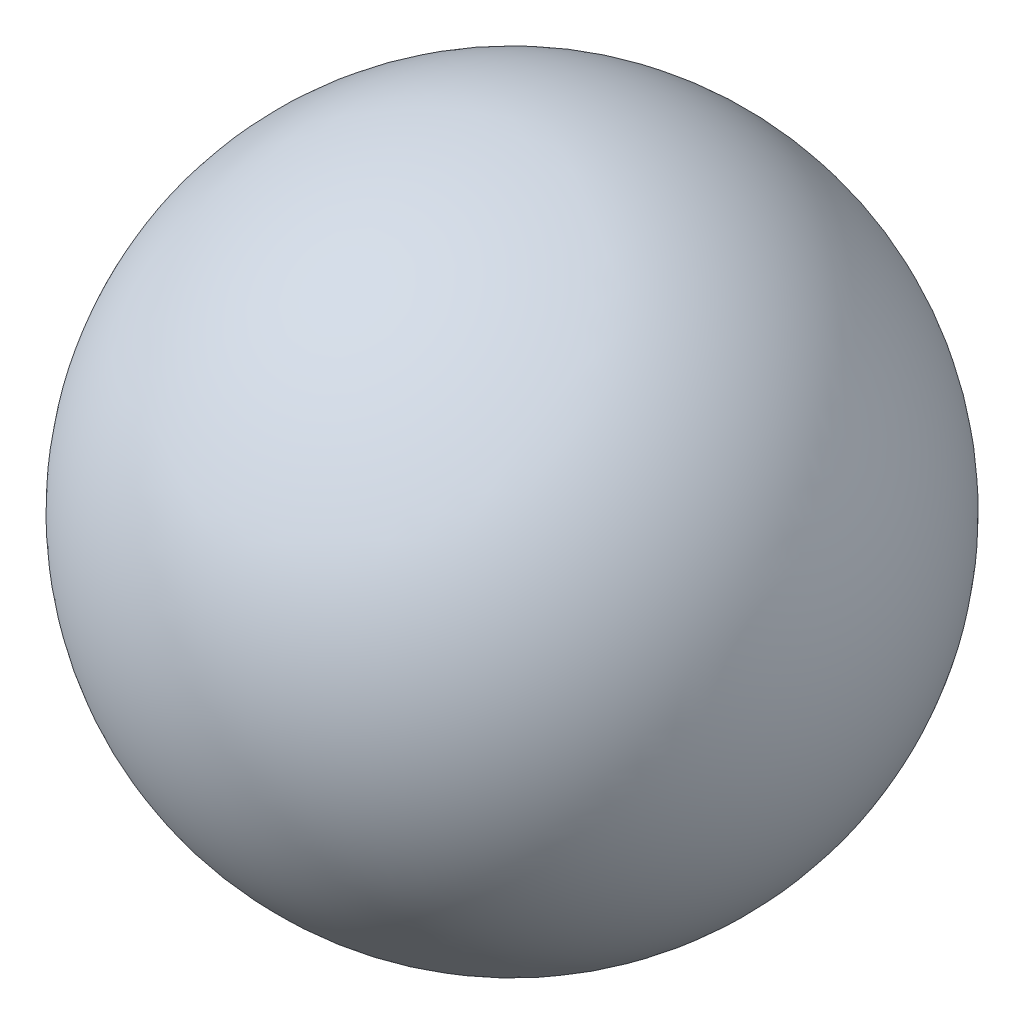
ISO-10303-21;
HEADER;
FILE_DESCRIPTION(('STEP AP214'),'2;1');
FILE_NAME('part.step','',(''),(''),'','','');
FILE_SCHEMA(('AUTOMOTIVE_DESIGN { 1 0 10303 214 1 1 1 1 }'));
ENDSEC;
DATA;
#1=APPLICATION_CONTEXT('core data for automotive mechanical design processes');
#2=APPLICATION_PROTOCOL_DEFINITION('international standard','automotive_design',2000,#1);
#3=PRODUCT_CONTEXT('',#1,'mechanical');
#4=PRODUCT('Part','Part','',(#3));
#5=PRODUCT_RELATED_PRODUCT_CATEGORY('part','',(#4));
#6=PRODUCT_DEFINITION_FORMATION('','',#4);
#7=PRODUCT_DEFINITION_CONTEXT('part definition',#1,'design');
#8=PRODUCT_DEFINITION('design','',#6,#7);
#9=PRODUCT_DEFINITION_SHAPE('','',#8);
#10=(LENGTH_UNIT() NAMED_UNIT(*) SI_UNIT(.MILLI.,.METRE.));
#11=(NAMED_UNIT(*) PLANE_ANGLE_UNIT() SI_UNIT($,.RADIAN.));
#12=(NAMED_UNIT(*) SI_UNIT($,.STERADIAN.) SOLID_ANGLE_UNIT());
#13=UNCERTAINTY_MEASURE_WITH_UNIT(LENGTH_MEASURE(1.E-05),#10,'distance_accuracy_value','');
#14=(GEOMETRIC_REPRESENTATION_CONTEXT(3) GLOBAL_UNCERTAINTY_ASSIGNED_CONTEXT((#13)) GLOBAL_UNIT_ASSIGNED_CONTEXT((#10,
#11,#12)) REPRESENTATION_CONTEXT('',''));
#15=CARTESIAN_POINT('',(0.,0.,0.));
#16=DIRECTION('',(0.,0.,1.));
#17=DIRECTION('',(1.,0.,0.));
#18=AXIS2_PLACEMENT_3D('',#15,#16,#17);
#19=CARTESIAN_POINT('',(0.,1150.,0.));
#20=DIRECTION('',(0.,-1.,0.));
#21=DIRECTION('',(1.,0.,0.));
#22=AXIS2_PLACEMENT_3D('',#19,#20,#21);
#23=PLANE('',#22);
#24=CARTESIAN_POINT('',(0.,1150.,0.));
#25=DIRECTION('',(0.,1.,0.));
#26=DIRECTION('',(-1.,0.,0.));
#27=AXIS2_PLACEMENT_3D('',#24,#25,#26);
#28=CIRCLE('',#27,342.782730020053);
#29=CARTESIAN_POINT('',(-342.782730020053,1150.,0.));
#30=VERTEX_POINT('',#29);
#31=EDGE_CURVE('E11',#30,#30,#28,.T.);
#32=ORIENTED_EDGE('',*,*,#31,.F.);
#33=EDGE_LOOP('',(#32));
#34=FACE_BOUND('',#33,.T.);
#35=ADVANCED_FACE('F42',(#34),#23,.T.);
#36=CARTESIAN_POINT('',(0.,0.,0.));
#37=DIRECTION('',(0.,1.,0.));
#38=DIRECTION('',(-1.,0.,0.));
#39=AXIS2_PLACEMENT_3D('',#36,#37,#38);
#40=SPHERICAL_SURFACE('',#39,1200.);
#41=ORIENTED_EDGE('',*,*,#31,.T.);
#42=EDGE_LOOP('',(#41));
#43=FACE_BOUND('',#42,.T.);
#44=ADVANCED_FACE('F49',(#43),#40,.T.);
#45=CLOSED_SHELL('',(#35,#44));
#46=MANIFOLD_SOLID_BREP('B2',#45);
#47=CARTESIAN_POINT('',(0.,1050.,0.));
#48=DIRECTION('',(0.,-1.,0.));
#49=DIRECTION('',(1.,0.,0.));
#50=AXIS2_PLACEMENT_3D('',#47,#48,#49);
#51=PLANE('',#50);
#52=CARTESIAN_POINT('',(0.,1050.,0.));
#53=DIRECTION('',(0.,1.,0.));
#54=DIRECTION('',(-1.,0.,0.));
#55=AXIS2_PLACEMENT_3D('',#52,#53,#54);
#56=CIRCLE('',#55,580.947501931114);
#57=CARTESIAN_POINT('',(-580.947501931114,1050.,0.));
#58=VERTEX_POINT('',#57);
#59=EDGE_CURVE('E41',#58,#58,#56,.T.);
#60=ORIENTED_EDGE('',*,*,#59,.F.);
#61=EDGE_LOOP('',(#60));
#62=FACE_BOUND('',#61,.T.);
#63=ADVANCED_FACE('F74',(#62),#51,.T.);
#64=CARTESIAN_POINT('',(0.,0.,0.));
#65=DIRECTION('',(0.,1.,0.));
#66=DIRECTION('',(-1.,0.,0.));
#67=AXIS2_PLACEMENT_3D('',#64,#65,#66);
#68=SPHERICAL_SURFACE('',#67,1200.);
#69=CARTESIAN_POINT('',(0.,1100.,0.));
#70=DIRECTION('',(0.,1.,0.));
#71=DIRECTION('',(-1.,0.,0.));
#72=AXIS2_PLACEMENT_3D('',#69,#70,#71);
#73=CIRCLE('',#72,479.583152331273);
#74=CARTESIAN_POINT('',(-479.583152331273,1100.,0.));
#75=VERTEX_POINT('',#74);
#76=EDGE_CURVE('E80',#75,#75,#73,.T.);
#77=CARTESIAN_POINT('',(-580.947501931114,1050.,0.));
#78=CARTESIAN_POINT('',(-579.916941721632,1050.57019179597,0.));
#79=CARTESIAN_POINT('',(-578.885542054221,1051.13886636215,0.));
#80=CARTESIAN_POINT('',(-576.821072757017,1052.27317612539,0.));
#81=CARTESIAN_POINT('',(-575.788003127223,1052.83881132245,0.));
#82=CARTESIAN_POINT('',(-573.720202858726,1053.96703743794,0.));
#83=CARTESIAN_POINT('',(-572.685472220023,1054.52962835637,0.));
#84=CARTESIAN_POINT('',(-570.61435890546,1055.65176103851,0.));
#85=CARTESIAN_POINT('',(-569.577976229601,1056.21130280222,0.));
#86=CARTESIAN_POINT('',(-567.503567825762,1057.32733232341,0.));
#87=CARTESIAN_POINT('',(-566.465542097784,1057.88382008088,0.));
#88=CARTESIAN_POINT('',(-564.387856589268,1058.99373676505,0.));
#89=CARTESIAN_POINT('',(-563.34819680873,1059.54716569173,0.));
#90=CARTESIAN_POINT('',(-561.267252208749,1060.65095991617,0.));
#91=CARTESIAN_POINT('',(-560.225967389306,1061.20132521391,0.));
#92=CARTESIAN_POINT('',(-558.141781739274,1062.29898740889,0.));
#93=CARTESIAN_POINT('',(-557.098880908686,1062.84628430612,0.));
#94=CARTESIAN_POINT('',(-555.011472278133,1063.93780495511,0.));
#95=CARTESIAN_POINT('',(-553.966964478167,1064.48202870687,0.));
#96=CARTESIAN_POINT('',(-551.876350964558,1065.56739834657,0.));
#97=CARTESIAN_POINT('',(-550.830245250915,1066.10854423452,0.));
#98=CARTESIAN_POINT('',(-548.736444979506,1067.18775345498,0.));
#99=CARTESIAN_POINT('',(-547.688750421739,1067.72581678749,0.));
#100=CARTESIAN_POINT('',(-545.59178154541,1068.79885623215,0.));
#101=CARTESIAN_POINT('',(-544.542507226848,1069.3338323443,0.));
#102=CARTESIAN_POINT('',(-542.442387925954,1070.40069271008,0.));
#103=CARTESIAN_POINT('',(-541.391542943622,1070.93257696373,0.));
#104=CARTESIAN_POINT('',(-539.288291425829,1071.99324900115,0.));
#105=CARTESIAN_POINT('',(-538.235884890369,1072.52203678494,0.));
#106=CARTESIAN_POINT('',(-536.129519390501,1073.57651129817,0.));
#107=CARTESIAN_POINT('',(-535.075560426093,1074.10219802761,0.));
#108=CARTESIAN_POINT('',(-532.966099205971,1075.15046587453,0.));
#109=CARTESIAN_POINT('',(-531.910596950256,1075.673046992,0.));
#110=CARTESIAN_POINT('',(-529.798058298539,1076.71509908431,0.));
#111=CARTESIAN_POINT('',(-528.741021902537,1077.23457005914,0.));
#112=CARTESIAN_POINT('',(-526.625424134566,1078.27039736243,0.));
#113=CARTESIAN_POINT('',(-525.566862762597,1078.78675369089,0.));
#114=CARTESIAN_POINT('',(-523.448224220235,1079.81634722471,0.));
#115=CARTESIAN_POINT('',(-522.388147049842,1080.32958443008,0.));
#116=CARTESIAN_POINT('',(-520.266486101315,1081.35293526805,0.));
#117=CARTESIAN_POINT('',(-519.20490232318,1081.86304890065,0.));
#118=CARTESIAN_POINT('',(-517.080237362917,1082.88014817049,0.));
#119=CARTESIAN_POINT('',(-516.017156180788,1083.38713380773,0.));
#120=CARTESIAN_POINT('',(-513.889505629263,1084.39797269137,0.));
#121=CARTESIAN_POINT('',(-512.824936259867,1084.90182593777,0.));
#122=CARTESIAN_POINT('',(-510.694318563437,1085.90639567141,0.));
#123=CARTESIAN_POINT('',(-509.628270236405,1086.40711215865,0.));
#124=CARTESIAN_POINT('',(-507.494703867155,1087.40540403284,0.));
#125=CARTESIAN_POINT('',(-506.427185824938,1087.9029794198,0.));
#126=CARTESIAN_POINT('',(-504.290689280514,1088.89498477953,0.));
#127=CARTESIAN_POINT('',(-503.221710778307,1089.38941475232,0.));
#128=CARTESIAN_POINT('',(-501.082302581762,1090.37512499708,0.));
#129=CARTESIAN_POINT('',(-500.011872887424,1090.86640526907,0.));
#130=CARTESIAN_POINT('',(-497.86957158705,1091.84581185292,0.));
#131=CARTESIAN_POINT('',(-496.797699981015,1092.33393816479,0.));
#132=CARTESIAN_POINT('',(-494.652524150199,1093.30703259647,0.));
#133=CARTESIAN_POINT('',(-493.579219925419,1093.79200071628,0.));
#134=CARTESIAN_POINT('',(-491.431188162426,1094.75877455914,0.));
#135=CARTESIAN_POINT('',(-490.356460624212,1095.2405802822,0.));
#136=CARTESIAN_POINT('',(-488.205591552234,1096.20102515479,0.));
#137=CARTESIAN_POINT('',(-487.129450018471,1096.67966430434,0.));
#138=CARTESIAN_POINT('',(-484.975762284666,1097.63377187863,0.));
#139=CARTESIAN_POINT('',(-483.898216084626,1098.10924030339,0.));
#140=CARTESIAN_POINT('',(-481.741728362963,1099.0570023117,0.));
#141=CARTESIAN_POINT('',(-480.66278684134,1099.52929589525,0.));
#142=CARTESIAN_POINT('',(-479.583152331273,1100.,0.));
#143=B_SPLINE_CURVE_WITH_KNOTS('',3,(#77,#78,#79,#80,#81,#82,#83,#84,#85,#86,#87,#88,#89,#90,
#91,#92,#93,#94,#95,#96,#97,#98,#99,#100,#101,#102,#103,#104,#105,#106,#107,#108,#109,#110,#111,
#112,#113,#114,#115,#116,#117,#118,#119,#120,#121,#122,#123,#124,#125,#126,#127,#128,#129,#130,
#131,#132,#133,#134,#135,#136,#137,#138,#139,#140,#141,#142),.UNSPECIFIED.,.F.,.F.,(4,2,2,2,2,2,
2,2,2,2,2,2,2,2,2,2,2,2,2,2,2,2,2,2,2,2,2,2,2,2,2,2,4),(0.,3.53334802217037,7.06669604434088,
10.6000440665113,14.1333920886819,17.6667401108522,21.2000881330224,24.7334361551929,
28.2667841773633,31.8001321995335,35.3334802217042,38.8668282438745,42.4001762660447,
45.9335242882152,49.4668723103856,53.0002203325561,56.5335683547265,60.0669163768968,
63.6002643990673,67.1336124212376,70.6669604434082,74.2003084655785,77.7336564877489,
81.2670045099193,84.8003525320897,88.33370055426,91.8670485764305,95.4003965986008,
98.9337446207712,102.467092642942,106.000440665112,109.533788687283,113.067136709453),.UNSPECIFIED.);
#144=EDGE_CURVE('BSEAM88',#58,#75,#143,.T.);
#145=ORIENTED_EDGE('',*,*,#59,.T.);
#146=ORIENTED_EDGE('',*,*,#76,.F.);
#147=ORIENTED_EDGE('',*,*,#144,.T.);
#148=ORIENTED_EDGE('',*,*,#144,.F.);
#149=EDGE_LOOP('',(#145,#147,#146,#148));
#150=FACE_BOUND('',#149,.T.);
#151=ADVANCED_FACE('F88',(#150),#68,.T.);
#152=CARTESIAN_POINT('',(-479.583152331273,1100.,0.));
#153=DIRECTION('',(0.,1.,0.));
#154=DIRECTION('',(-1.,0.,0.));
#155=AXIS2_PLACEMENT_3D('',#152,#153,#154);
#156=PLANE('',#155);
#157=ORIENTED_EDGE('',*,*,#76,.T.);
#158=EDGE_LOOP('',(#157));
#159=FACE_BOUND('',#158,.T.);
#160=ADVANCED_FACE('F86',(#159),#156,.T.);
#161=CLOSED_SHELL('',(#63,#151,#160));
#162=MANIFOLD_SOLID_BREP('B6',#161);
#163=CARTESIAN_POINT('',(0.,0.,0.));
#164=DIRECTION('',(-1.,0.,0.));
#165=DIRECTION('',(0.,0.,1.));
#166=AXIS2_PLACEMENT_3D('',#163,#164,#165);
#167=SPHERICAL_SURFACE('',#166,1260.);
#168=CARTESIAN_POINT('',(-1260.,0.,0.));
#169=VERTEX_POINT('',#168);
#170=VERTEX_LOOP('',#169);
#171=FACE_BOUND('',#170,.T.);
#172=ADVANCED_FACE('F115',(#171),#167,.T.);
#173=CLOSED_SHELL('',(#172));
#174=CARTESIAN_POINT('',(0.,0.,0.));
#175=DIRECTION('',(-1.,0.,0.));
#176=DIRECTION('',(0.,0.,1.));
#177=AXIS2_PLACEMENT_3D('',#174,#175,#176);
#178=SPHERICAL_SURFACE('',#177,1250.);
#179=CARTESIAN_POINT('',(0.,0.,0.));
#180=DIRECTION('',(0.,1.,0.));
#181=DIRECTION('',(0.,0.,1.));
#182=AXIS2_PLACEMENT_3D('',#179,#180,#181);
#183=SPHERICAL_SURFACE('',#182,1250.);
#184=CARTESIAN_POINT('',(0.,-1221.35180568915,0.));
#185=DIRECTION('',(0.,1.,0.));
#186=DIRECTION('',(0.,0.,1.));
#187=AXIS2_PLACEMENT_3D('',#184,#185,#186);
#188=CIRCLE('',#187,266.082255590035);
#189=CARTESIAN_POINT('',(0.,-1221.35180568915,266.082255590035));
#190=VERTEX_POINT('',#189);
#191=EDGE_CURVE('E73',#190,#190,#188,.T.);
#192=ORIENTED_EDGE('',*,*,#191,.F.);
#193=EDGE_LOOP('',(#192));
#194=FACE_BOUND('',#193,.T.);
#195=ADVANCED_FACE('F117',(#194),#183,.F.);
#196=CARTESIAN_POINT('',(0.,-300.,0.));
#197=DIRECTION('',(0.,1.,0.));
#198=DIRECTION('',(0.,0.,1.));
#199=AXIS2_PLACEMENT_3D('',#196,#197,#198);
#200=PLANE('',#199);
#201=CARTESIAN_POINT('',(0.,-300.,0.));
#202=DIRECTION('',(0.,1.,0.));
#203=DIRECTION('',(0.,0.,1.));
#204=AXIS2_PLACEMENT_3D('',#201,#202,#203);
#205=CIRCLE('',#204,250.);
#206=CARTESIAN_POINT('',(0.,-300.,250.));
#207=VERTEX_POINT('',#206);
#208=EDGE_CURVE('E123',#207,#207,#205,.T.);
#209=ORIENTED_EDGE('',*,*,#208,.T.);
#210=EDGE_LOOP('',(#209));
#211=FACE_BOUND('',#210,.T.);
#212=ADVANCED_FACE('F129',(#211),#200,.T.);
#213=CARTESIAN_POINT('',(0.,-300.,0.));
#214=DIRECTION('',(0.,-1.,0.));
#215=DIRECTION('',(0.,0.,1.));
#216=AXIS2_PLACEMENT_3D('',#213,#214,#215);
#217=CONICAL_SURFACE('',#216,250.,0.0174532925199433);
#218=ORIENTED_EDGE('',*,*,#191,.T.);
#219=EDGE_LOOP('',(#218));
#220=FACE_BOUND('',#219,.T.);
#221=ORIENTED_EDGE('',*,*,#208,.F.);
#222=EDGE_LOOP('',(#221));
#223=FACE_BOUND('',#222,.T.);
#224=ADVANCED_FACE('F131',(#220,#223),#217,.T.);
#225=CLOSED_SHELL('',(#195,#212,#224));
#226=ORIENTED_CLOSED_SHELL('',*,#225,.T.);
#227=BREP_WITH_VOIDS('B36',#173,(#226));
#228=ADVANCED_BREP_SHAPE_REPRESENTATION('',(#18,#46,#162,#227),#14);
#229=SHAPE_DEFINITION_REPRESENTATION(#9,#228);
ENDSEC;
END-ISO-10303-21;
